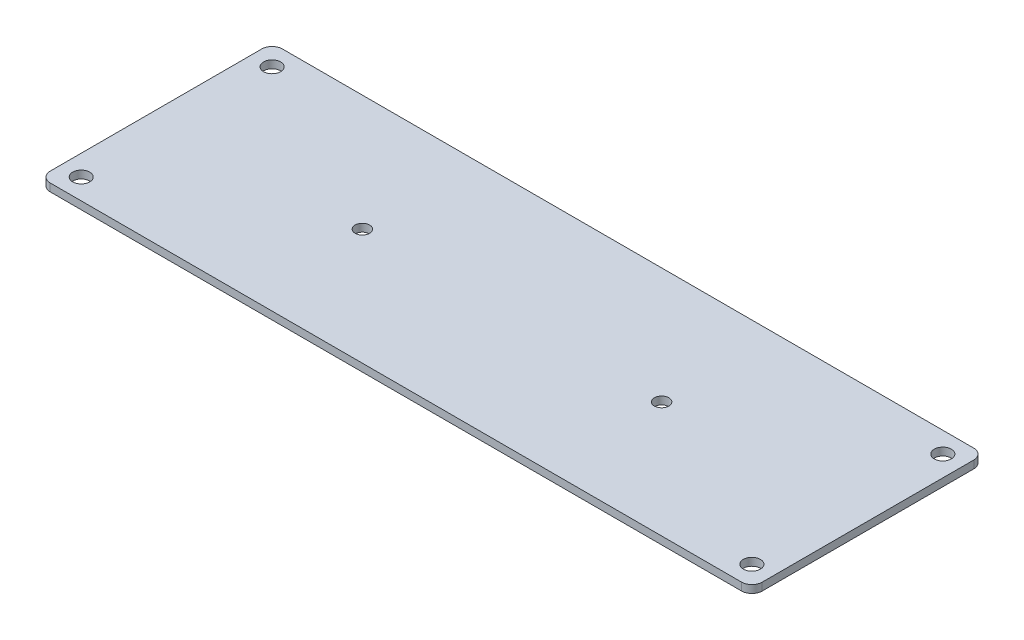
ISO-10303-21;
HEADER;
FILE_DESCRIPTION(('STEP AP214'),'2;1');
FILE_NAME('part.step','',(''),(''),'','','');
FILE_SCHEMA(('AUTOMOTIVE_DESIGN { 1 0 10303 214 1 1 1 1 }'));
ENDSEC;
DATA;
#1=APPLICATION_CONTEXT('core data for automotive mechanical design processes');
#2=APPLICATION_PROTOCOL_DEFINITION('international standard','automotive_design',2000,#1);
#3=PRODUCT_CONTEXT('',#1,'mechanical');
#4=PRODUCT('Part','Part','',(#3));
#5=PRODUCT_RELATED_PRODUCT_CATEGORY('part','',(#4));
#6=PRODUCT_DEFINITION_FORMATION('','',#4);
#7=PRODUCT_DEFINITION_CONTEXT('part definition',#1,'design');
#8=PRODUCT_DEFINITION('design','',#6,#7);
#9=PRODUCT_DEFINITION_SHAPE('','',#8);
#10=(LENGTH_UNIT() NAMED_UNIT(*) SI_UNIT(.MILLI.,.METRE.));
#11=(NAMED_UNIT(*) PLANE_ANGLE_UNIT() SI_UNIT($,.RADIAN.));
#12=(NAMED_UNIT(*) SI_UNIT($,.STERADIAN.) SOLID_ANGLE_UNIT());
#13=UNCERTAINTY_MEASURE_WITH_UNIT(LENGTH_MEASURE(1.E-05),#10,'distance_accuracy_value','');
#14=(GEOMETRIC_REPRESENTATION_CONTEXT(3) GLOBAL_UNCERTAINTY_ASSIGNED_CONTEXT((#13)) GLOBAL_UNIT_ASSIGNED_CONTEXT((#10,
#11,#12)) REPRESENTATION_CONTEXT('',''));
#15=CARTESIAN_POINT('',(0.,0.,0.));
#16=DIRECTION('',(0.,0.,1.));
#17=DIRECTION('',(1.,0.,0.));
#18=AXIS2_PLACEMENT_3D('',#15,#16,#17);
#19=CARTESIAN_POINT('',(0.,1.5,0.));
#20=DIRECTION('',(0.,1.,0.));
#21=DIRECTION('',(0.,0.,1.));
#22=AXIS2_PLACEMENT_3D('',#19,#20,#21);
#23=PLANE('',#22);
#24=CARTESIAN_POINT('',(-65.,1.5,18.5));
#25=DIRECTION('',(0.,1.,0.));
#26=DIRECTION('',(0.,0.,1.));
#27=AXIS2_PLACEMENT_3D('',#24,#25,#26);
#28=CIRCLE('',#27,1.65);
#29=CARTESIAN_POINT('',(-65.,1.5,20.15));
#30=VERTEX_POINT('',#29);
#31=EDGE_CURVE('E253',#30,#30,#28,.T.);
#32=ORIENTED_EDGE('',*,*,#31,.F.);
#33=EDGE_LOOP('',(#32));
#34=FACE_BOUND('',#33,.T.);
#35=CARTESIAN_POINT('',(65.,1.5,-18.5));
#36=DIRECTION('',(0.,1.,0.));
#37=DIRECTION('',(0.,0.,1.));
#38=AXIS2_PLACEMENT_3D('',#35,#36,#37);
#39=CIRCLE('',#38,1.65);
#40=CARTESIAN_POINT('',(65.,1.5,-16.85));
#41=VERTEX_POINT('',#40);
#42=EDGE_CURVE('E244',#41,#41,#39,.T.);
#43=ORIENTED_EDGE('',*,*,#42,.F.);
#44=EDGE_LOOP('',(#43));
#45=FACE_BOUND('',#44,.T.);
#46=CARTESIAN_POINT('',(65.,1.5,18.5));
#47=DIRECTION('',(0.,1.,0.));
#48=DIRECTION('',(0.,0.,1.));
#49=AXIS2_PLACEMENT_3D('',#46,#47,#48);
#50=CIRCLE('',#49,1.65);
#51=CARTESIAN_POINT('',(65.,1.5,20.15));
#52=VERTEX_POINT('',#51);
#53=EDGE_CURVE('E260',#52,#52,#50,.T.);
#54=ORIENTED_EDGE('',*,*,#53,.F.);
#55=EDGE_LOOP('',(#54));
#56=FACE_BOUND('',#55,.T.);
#57=CARTESIAN_POINT('',(-65.,1.5,-18.5));
#58=DIRECTION('',(0.,1.,0.));
#59=DIRECTION('',(0.,0.,1.));
#60=AXIS2_PLACEMENT_3D('',#57,#58,#59);
#61=CIRCLE('',#60,1.65);
#62=CARTESIAN_POINT('',(-65.,1.5,-16.85));
#63=VERTEX_POINT('',#62);
#64=EDGE_CURVE('E236',#63,#63,#61,.T.);
#65=ORIENTED_EDGE('',*,*,#64,.F.);
#66=EDGE_LOOP('',(#65));
#67=FACE_BOUND('',#66,.T.);
#68=CARTESIAN_POINT('',(-29.,1.5,0.));
#69=DIRECTION('',(0.,1.,0.));
#70=DIRECTION('',(0.,0.,1.));
#71=AXIS2_PLACEMENT_3D('',#68,#69,#70);
#72=CIRCLE('',#71,1.4);
#73=CARTESIAN_POINT('',(-29.,1.5,1.4));
#74=VERTEX_POINT('',#73);
#75=EDGE_CURVE('E151',#74,#74,#72,.T.);
#76=ORIENTED_EDGE('',*,*,#75,.F.);
#77=EDGE_LOOP('',(#76));
#78=FACE_BOUND('',#77,.T.);
#79=DIRECTION('',(-1.,0.,0.));
#80=VECTOR('',#79,1.);
#81=CARTESIAN_POINT('',(69.,1.5,-22.5));
#82=LINE('',#81,#80);
#83=CARTESIAN_POINT('',(67.,1.5,-22.5));
#84=VERTEX_POINT('',#83);
#85=CARTESIAN_POINT('',(-67.,1.5,-22.5));
#86=VERTEX_POINT('',#85);
#87=EDGE_CURVE('E163',#84,#86,#82,.T.);
#88=ORIENTED_EDGE('',*,*,#87,.T.);
#89=CARTESIAN_POINT('',(-67.,1.5,-20.5));
#90=DIRECTION('',(0.,1.,0.));
#91=DIRECTION('',(0.,0.,1.));
#92=AXIS2_PLACEMENT_3D('',#89,#90,#91);
#93=CIRCLE('',#92,2.);
#94=CARTESIAN_POINT('',(-69.,1.5,-20.5));
#95=VERTEX_POINT('',#94);
#96=EDGE_CURVE('E193',#86,#95,#93,.T.);
#97=ORIENTED_EDGE('',*,*,#96,.T.);
#98=DIRECTION('',(0.,0.,1.));
#99=VECTOR('',#98,1.);
#100=CARTESIAN_POINT('',(-69.,1.5,22.5));
#101=LINE('',#100,#99);
#102=CARTESIAN_POINT('',(-69.,1.5,20.5));
#103=VERTEX_POINT('',#102);
#104=EDGE_CURVE('E141',#95,#103,#101,.T.);
#105=ORIENTED_EDGE('',*,*,#104,.T.);
#106=CARTESIAN_POINT('',(-67.,1.5,20.5));
#107=DIRECTION('',(0.,1.,0.));
#108=DIRECTION('',(0.,0.,1.));
#109=AXIS2_PLACEMENT_3D('',#106,#107,#108);
#110=CIRCLE('',#109,2.);
#111=CARTESIAN_POINT('',(-67.,1.5,22.5));
#112=VERTEX_POINT('',#111);
#113=EDGE_CURVE('E185',#103,#112,#110,.T.);
#114=ORIENTED_EDGE('',*,*,#113,.T.);
#115=DIRECTION('',(1.,0.,0.));
#116=VECTOR('',#115,1.);
#117=CARTESIAN_POINT('',(69.,1.5,22.5));
#118=LINE('',#117,#116);
#119=CARTESIAN_POINT('',(67.,1.5,22.5));
#120=VERTEX_POINT('',#119);
#121=EDGE_CURVE('E209',#112,#120,#118,.T.);
#122=ORIENTED_EDGE('',*,*,#121,.T.);
#123=CARTESIAN_POINT('',(67.,1.5,20.5));
#124=DIRECTION('',(0.,1.,0.));
#125=DIRECTION('',(0.,0.,1.));
#126=AXIS2_PLACEMENT_3D('',#123,#124,#125);
#127=CIRCLE('',#126,2.);
#128=CARTESIAN_POINT('',(69.,1.5,20.5));
#129=VERTEX_POINT('',#128);
#130=EDGE_CURVE('E67',#120,#129,#127,.T.);
#131=ORIENTED_EDGE('',*,*,#130,.T.);
#132=DIRECTION('',(0.,0.,-1.));
#133=VECTOR('',#132,1.);
#134=CARTESIAN_POINT('',(69.,1.5,22.5));
#135=LINE('',#134,#133);
#136=CARTESIAN_POINT('',(69.,1.5,-20.5));
#137=VERTEX_POINT('',#136);
#138=EDGE_CURVE('E217',#129,#137,#135,.T.);
#139=ORIENTED_EDGE('',*,*,#138,.T.);
#140=CARTESIAN_POINT('',(67.,1.5,-20.5));
#141=DIRECTION('',(0.,1.,0.));
#142=DIRECTION('',(0.,0.,1.));
#143=AXIS2_PLACEMENT_3D('',#140,#141,#142);
#144=CIRCLE('',#143,2.);
#145=EDGE_CURVE('E190',#137,#84,#144,.T.);
#146=ORIENTED_EDGE('',*,*,#145,.T.);
#147=EDGE_LOOP('',(#88,#97,#105,#114,#122,#131,#139,#146));
#148=FACE_BOUND('',#147,.T.);
#149=CARTESIAN_POINT('',(29.,1.5,0.));
#150=DIRECTION('',(0.,1.,0.));
#151=DIRECTION('',(0.,0.,1.));
#152=AXIS2_PLACEMENT_3D('',#149,#150,#151);
#153=CIRCLE('',#152,1.4);
#154=CARTESIAN_POINT('',(29.,1.5,1.4));
#155=VERTEX_POINT('',#154);
#156=EDGE_CURVE('E226',#155,#155,#153,.T.);
#157=ORIENTED_EDGE('',*,*,#156,.F.);
#158=EDGE_LOOP('',(#157));
#159=FACE_BOUND('',#158,.T.);
#160=ADVANCED_FACE('F38',(#34,#45,#56,#67,#78,#148,#159),#23,.T.);
#161=CARTESIAN_POINT('',(0.,0.,0.));
#162=DIRECTION('',(0.,1.,0.));
#163=DIRECTION('',(0.,0.,1.));
#164=AXIS2_PLACEMENT_3D('',#161,#162,#163);
#165=PLANE('',#164);
#166=CARTESIAN_POINT('',(-65.,0.,18.5));
#167=DIRECTION('',(0.,1.,0.));
#168=DIRECTION('',(0.,0.,1.));
#169=AXIS2_PLACEMENT_3D('',#166,#167,#168);
#170=CIRCLE('',#169,1.65);
#171=CARTESIAN_POINT('',(-65.,0.,20.15));
#172=VERTEX_POINT('',#171);
#173=EDGE_CURVE('E240',#172,#172,#170,.T.);
#174=ORIENTED_EDGE('',*,*,#173,.T.);
#175=EDGE_LOOP('',(#174));
#176=FACE_BOUND('',#175,.T.);
#177=CARTESIAN_POINT('',(65.,0.,-18.5));
#178=DIRECTION('',(0.,1.,0.));
#179=DIRECTION('',(0.,0.,1.));
#180=AXIS2_PLACEMENT_3D('',#177,#178,#179);
#181=CIRCLE('',#180,1.65);
#182=CARTESIAN_POINT('',(65.,0.,-16.85));
#183=VERTEX_POINT('',#182);
#184=EDGE_CURVE('E248',#183,#183,#181,.T.);
#185=ORIENTED_EDGE('',*,*,#184,.T.);
#186=EDGE_LOOP('',(#185));
#187=FACE_BOUND('',#186,.T.);
#188=CARTESIAN_POINT('',(65.,0.,18.5));
#189=DIRECTION('',(0.,1.,0.));
#190=DIRECTION('',(0.,0.,1.));
#191=AXIS2_PLACEMENT_3D('',#188,#189,#190);
#192=CIRCLE('',#191,1.65);
#193=CARTESIAN_POINT('',(65.,0.,20.15));
#194=VERTEX_POINT('',#193);
#195=EDGE_CURVE('E249',#194,#194,#192,.T.);
#196=ORIENTED_EDGE('',*,*,#195,.T.);
#197=EDGE_LOOP('',(#196));
#198=FACE_BOUND('',#197,.T.);
#199=CARTESIAN_POINT('',(-65.,0.,-18.5));
#200=DIRECTION('',(0.,1.,0.));
#201=DIRECTION('',(0.,0.,1.));
#202=AXIS2_PLACEMENT_3D('',#199,#200,#201);
#203=CIRCLE('',#202,1.65);
#204=CARTESIAN_POINT('',(-65.,0.,-16.85));
#205=VERTEX_POINT('',#204);
#206=EDGE_CURVE('E232',#205,#205,#203,.T.);
#207=ORIENTED_EDGE('',*,*,#206,.T.);
#208=EDGE_LOOP('',(#207));
#209=FACE_BOUND('',#208,.T.);
#210=DIRECTION('',(0.,0.,1.));
#211=VECTOR('',#210,1.);
#212=CARTESIAN_POINT('',(-69.,0.,22.5));
#213=LINE('',#212,#211);
#214=CARTESIAN_POINT('',(-69.,0.,-20.5));
#215=VERTEX_POINT('',#214);
#216=CARTESIAN_POINT('',(-69.,0.,20.5));
#217=VERTEX_POINT('',#216);
#218=EDGE_CURVE('E138',#215,#217,#213,.T.);
#219=ORIENTED_EDGE('',*,*,#218,.F.);
#220=CARTESIAN_POINT('',(-67.,0.,-20.5));
#221=DIRECTION('',(0.,1.,0.));
#222=DIRECTION('',(0.,0.,1.));
#223=AXIS2_PLACEMENT_3D('',#220,#221,#222);
#224=CIRCLE('',#223,2.);
#225=CARTESIAN_POINT('',(-67.,0.,-22.5));
#226=VERTEX_POINT('',#225);
#227=EDGE_CURVE('E120',#215,#226,#224,.F.);
#228=ORIENTED_EDGE('',*,*,#227,.T.);
#229=DIRECTION('',(-1.,0.,0.));
#230=VECTOR('',#229,1.);
#231=CARTESIAN_POINT('',(69.,0.,-22.5));
#232=LINE('',#231,#230);
#233=CARTESIAN_POINT('',(67.,0.,-22.5));
#234=VERTEX_POINT('',#233);
#235=EDGE_CURVE('E168',#234,#226,#232,.T.);
#236=ORIENTED_EDGE('',*,*,#235,.F.);
#237=CARTESIAN_POINT('',(67.,0.,-20.5));
#238=DIRECTION('',(0.,1.,0.));
#239=DIRECTION('',(0.,0.,1.));
#240=AXIS2_PLACEMENT_3D('',#237,#238,#239);
#241=CIRCLE('',#240,2.);
#242=CARTESIAN_POINT('',(69.,0.,-20.5));
#243=VERTEX_POINT('',#242);
#244=EDGE_CURVE('E132',#234,#243,#241,.F.);
#245=ORIENTED_EDGE('',*,*,#244,.T.);
#246=DIRECTION('',(0.,0.,-1.));
#247=VECTOR('',#246,1.);
#248=CARTESIAN_POINT('',(69.,0.,22.5));
#249=LINE('',#248,#247);
#250=CARTESIAN_POINT('',(69.,0.,20.5));
#251=VERTEX_POINT('',#250);
#252=EDGE_CURVE('E157',#251,#243,#249,.T.);
#253=ORIENTED_EDGE('',*,*,#252,.F.);
#254=CARTESIAN_POINT('',(67.,0.,20.5));
#255=DIRECTION('',(0.,1.,0.));
#256=DIRECTION('',(0.,0.,1.));
#257=AXIS2_PLACEMENT_3D('',#254,#255,#256);
#258=CIRCLE('',#257,2.);
#259=CARTESIAN_POINT('',(67.,0.,22.5));
#260=VERTEX_POINT('',#259);
#261=EDGE_CURVE('E175',#251,#260,#258,.F.);
#262=ORIENTED_EDGE('',*,*,#261,.T.);
#263=DIRECTION('',(1.,0.,0.));
#264=VECTOR('',#263,1.);
#265=CARTESIAN_POINT('',(69.,0.,22.5));
#266=LINE('',#265,#264);
#267=CARTESIAN_POINT('',(-67.,0.,22.5));
#268=VERTEX_POINT('',#267);
#269=EDGE_CURVE('E150',#268,#260,#266,.T.);
#270=ORIENTED_EDGE('',*,*,#269,.F.);
#271=CARTESIAN_POINT('',(-67.,0.,20.5));
#272=DIRECTION('',(0.,1.,0.));
#273=DIRECTION('',(0.,0.,1.));
#274=AXIS2_PLACEMENT_3D('',#271,#272,#273);
#275=CIRCLE('',#274,2.);
#276=EDGE_CURVE('E143',#268,#217,#275,.F.);
#277=ORIENTED_EDGE('',*,*,#276,.T.);
#278=EDGE_LOOP('',(#219,#228,#236,#245,#253,#262,#270,#277));
#279=FACE_BOUND('',#278,.T.);
#280=CARTESIAN_POINT('',(-29.,0.,0.));
#281=DIRECTION('',(0.,1.,0.));
#282=DIRECTION('',(0.,0.,1.));
#283=AXIS2_PLACEMENT_3D('',#280,#281,#282);
#284=CIRCLE('',#283,1.4);
#285=CARTESIAN_POINT('',(-29.,0.,1.4));
#286=VERTEX_POINT('',#285);
#287=EDGE_CURVE('E160',#286,#286,#284,.T.);
#288=ORIENTED_EDGE('',*,*,#287,.T.);
#289=EDGE_LOOP('',(#288));
#290=FACE_BOUND('',#289,.T.);
#291=CARTESIAN_POINT('',(29.,0.,0.));
#292=DIRECTION('',(0.,1.,0.));
#293=DIRECTION('',(0.,0.,1.));
#294=AXIS2_PLACEMENT_3D('',#291,#292,#293);
#295=CIRCLE('',#294,1.4);
#296=CARTESIAN_POINT('',(29.,0.,1.4));
#297=VERTEX_POINT('',#296);
#298=EDGE_CURVE('E228',#297,#297,#295,.T.);
#299=ORIENTED_EDGE('',*,*,#298,.T.);
#300=EDGE_LOOP('',(#299));
#301=FACE_BOUND('',#300,.T.);
#302=ADVANCED_FACE('F146',(#176,#187,#198,#209,#279,#290,#301),#165,.F.);
#303=CARTESIAN_POINT('',(-69.,1.5,22.5));
#304=DIRECTION('',(1.,0.,0.));
#305=DIRECTION('',(0.,0.,-1.));
#306=AXIS2_PLACEMENT_3D('',#303,#304,#305);
#307=PLANE('',#306);
#308=ORIENTED_EDGE('',*,*,#104,.F.);
#309=DIRECTION('',(0.,-1.,0.));
#310=VECTOR('',#309,1.);
#311=CARTESIAN_POINT('',(-69.,1.5,-20.5));
#312=LINE('',#311,#310);
#313=EDGE_CURVE('E124',#95,#215,#312,.T.);
#314=ORIENTED_EDGE('',*,*,#313,.T.);
#315=ORIENTED_EDGE('',*,*,#218,.T.);
#316=DIRECTION('',(0.,-1.,0.));
#317=VECTOR('',#316,1.);
#318=CARTESIAN_POINT('',(-69.,1.5,20.5));
#319=LINE('',#318,#317);
#320=EDGE_CURVE('E144',#217,#103,#319,.F.);
#321=ORIENTED_EDGE('',*,*,#320,.T.);
#322=EDGE_LOOP('',(#308,#314,#315,#321));
#323=FACE_BOUND('',#322,.T.);
#324=ADVANCED_FACE('F137',(#323),#307,.F.);
#325=CARTESIAN_POINT('',(69.,1.5,22.5));
#326=DIRECTION('',(0.,0.,-1.));
#327=DIRECTION('',(-1.,0.,0.));
#328=AXIS2_PLACEMENT_3D('',#325,#326,#327);
#329=PLANE('',#328);
#330=ORIENTED_EDGE('',*,*,#269,.T.);
#331=DIRECTION('',(0.,-1.,0.));
#332=VECTOR('',#331,1.);
#333=CARTESIAN_POINT('',(67.,1.5,22.5));
#334=LINE('',#333,#332);
#335=EDGE_CURVE('E11',#260,#120,#334,.F.);
#336=ORIENTED_EDGE('',*,*,#335,.T.);
#337=ORIENTED_EDGE('',*,*,#121,.F.);
#338=DIRECTION('',(0.,-1.,0.));
#339=VECTOR('',#338,1.);
#340=CARTESIAN_POINT('',(-67.,1.5,22.5));
#341=LINE('',#340,#339);
#342=EDGE_CURVE('E47',#112,#268,#341,.T.);
#343=ORIENTED_EDGE('',*,*,#342,.T.);
#344=EDGE_LOOP('',(#330,#336,#337,#343));
#345=FACE_BOUND('',#344,.T.);
#346=ADVANCED_FACE('F207',(#345),#329,.F.);
#347=CARTESIAN_POINT('',(69.,1.5,22.5));
#348=DIRECTION('',(-1.,0.,0.));
#349=DIRECTION('',(0.,0.,1.));
#350=AXIS2_PLACEMENT_3D('',#347,#348,#349);
#351=PLANE('',#350);
#352=ORIENTED_EDGE('',*,*,#252,.T.);
#353=DIRECTION('',(0.,-1.,0.));
#354=VECTOR('',#353,1.);
#355=CARTESIAN_POINT('',(69.,1.5,-20.5));
#356=LINE('',#355,#354);
#357=EDGE_CURVE('E57',#243,#137,#356,.F.);
#358=ORIENTED_EDGE('',*,*,#357,.T.);
#359=ORIENTED_EDGE('',*,*,#138,.F.);
#360=DIRECTION('',(0.,-1.,0.));
#361=VECTOR('',#360,1.);
#362=CARTESIAN_POINT('',(69.,1.5,20.5));
#363=LINE('',#362,#361);
#364=EDGE_CURVE('E196',#129,#251,#363,.T.);
#365=ORIENTED_EDGE('',*,*,#364,.T.);
#366=EDGE_LOOP('',(#352,#358,#359,#365));
#367=FACE_BOUND('',#366,.T.);
#368=ADVANCED_FACE('F216',(#367),#351,.F.);
#369=CARTESIAN_POINT('',(69.,1.5,-22.5));
#370=DIRECTION('',(0.,0.,1.));
#371=DIRECTION('',(1.,0.,0.));
#372=AXIS2_PLACEMENT_3D('',#369,#370,#371);
#373=PLANE('',#372);
#374=ORIENTED_EDGE('',*,*,#235,.T.);
#375=DIRECTION('',(0.,-1.,0.));
#376=VECTOR('',#375,1.);
#377=CARTESIAN_POINT('',(-67.,1.5,-22.5));
#378=LINE('',#377,#376);
#379=EDGE_CURVE('E125',#226,#86,#378,.F.);
#380=ORIENTED_EDGE('',*,*,#379,.T.);
#381=ORIENTED_EDGE('',*,*,#87,.F.);
#382=DIRECTION('',(0.,-1.,0.));
#383=VECTOR('',#382,1.);
#384=CARTESIAN_POINT('',(67.,1.5,-22.5));
#385=LINE('',#384,#383);
#386=EDGE_CURVE('E131',#84,#234,#385,.T.);
#387=ORIENTED_EDGE('',*,*,#386,.T.);
#388=EDGE_LOOP('',(#374,#380,#381,#387));
#389=FACE_BOUND('',#388,.T.);
#390=ADVANCED_FACE('F305',(#389),#373,.F.);
#391=CARTESIAN_POINT('',(-29.,1.5,0.));
#392=DIRECTION('',(0.,-1.,0.));
#393=DIRECTION('',(0.,0.,-1.));
#394=AXIS2_PLACEMENT_3D('',#391,#392,#393);
#395=CYLINDRICAL_SURFACE('',#394,1.4);
#396=ORIENTED_EDGE('',*,*,#75,.T.);
#397=EDGE_LOOP('',(#396));
#398=FACE_BOUND('',#397,.T.);
#399=ORIENTED_EDGE('',*,*,#287,.F.);
#400=EDGE_LOOP('',(#399));
#401=FACE_BOUND('',#400,.T.);
#402=ADVANCED_FACE('F291',(#398,#401),#395,.F.);
#403=CARTESIAN_POINT('',(29.,1.5,0.));
#404=DIRECTION('',(0.,-1.,0.));
#405=DIRECTION('',(0.,0.,-1.));
#406=AXIS2_PLACEMENT_3D('',#403,#404,#405);
#407=CYLINDRICAL_SURFACE('',#406,1.4);
#408=ORIENTED_EDGE('',*,*,#156,.T.);
#409=EDGE_LOOP('',(#408));
#410=FACE_BOUND('',#409,.T.);
#411=ORIENTED_EDGE('',*,*,#298,.F.);
#412=EDGE_LOOP('',(#411));
#413=FACE_BOUND('',#412,.T.);
#414=ADVANCED_FACE('F288',(#410,#413),#407,.F.);
#415=CARTESIAN_POINT('',(-65.,0.,-18.5));
#416=DIRECTION('',(0.,1.,0.));
#417=DIRECTION('',(0.,0.,1.));
#418=AXIS2_PLACEMENT_3D('',#415,#416,#417);
#419=CYLINDRICAL_SURFACE('',#418,1.65);
#420=ORIENTED_EDGE('',*,*,#206,.F.);
#421=EDGE_LOOP('',(#420));
#422=FACE_BOUND('',#421,.T.);
#423=ORIENTED_EDGE('',*,*,#64,.T.);
#424=EDGE_LOOP('',(#423));
#425=FACE_BOUND('',#424,.T.);
#426=ADVANCED_FACE('F273',(#422,#425),#419,.F.);
#427=CARTESIAN_POINT('',(65.,0.,18.5));
#428=DIRECTION('',(0.,1.,0.));
#429=DIRECTION('',(0.,0.,1.));
#430=AXIS2_PLACEMENT_3D('',#427,#428,#429);
#431=CYLINDRICAL_SURFACE('',#430,1.65);
#432=ORIENTED_EDGE('',*,*,#195,.F.);
#433=EDGE_LOOP('',(#432));
#434=FACE_BOUND('',#433,.T.);
#435=ORIENTED_EDGE('',*,*,#53,.T.);
#436=EDGE_LOOP('',(#435));
#437=FACE_BOUND('',#436,.T.);
#438=ADVANCED_FACE('F269',(#434,#437),#431,.F.);
#439=CARTESIAN_POINT('',(65.,0.,-18.5));
#440=DIRECTION('',(0.,1.,0.));
#441=DIRECTION('',(0.,0.,1.));
#442=AXIS2_PLACEMENT_3D('',#439,#440,#441);
#443=CYLINDRICAL_SURFACE('',#442,1.65);
#444=ORIENTED_EDGE('',*,*,#184,.F.);
#445=EDGE_LOOP('',(#444));
#446=FACE_BOUND('',#445,.T.);
#447=ORIENTED_EDGE('',*,*,#42,.T.);
#448=EDGE_LOOP('',(#447));
#449=FACE_BOUND('',#448,.T.);
#450=ADVANCED_FACE('F272',(#446,#449),#443,.F.);
#451=CARTESIAN_POINT('',(-65.,0.,18.5));
#452=DIRECTION('',(0.,1.,0.));
#453=DIRECTION('',(0.,0.,1.));
#454=AXIS2_PLACEMENT_3D('',#451,#452,#453);
#455=CYLINDRICAL_SURFACE('',#454,1.65);
#456=ORIENTED_EDGE('',*,*,#173,.F.);
#457=EDGE_LOOP('',(#456));
#458=FACE_BOUND('',#457,.T.);
#459=ORIENTED_EDGE('',*,*,#31,.T.);
#460=EDGE_LOOP('',(#459));
#461=FACE_BOUND('',#460,.T.);
#462=ADVANCED_FACE('F316',(#458,#461),#455,.F.);
#463=CARTESIAN_POINT('',(-67.,1.5,-20.5));
#464=DIRECTION('',(0.,-1.,0.));
#465=DIRECTION('',(0.,0.,-1.));
#466=AXIS2_PLACEMENT_3D('',#463,#464,#465);
#467=CYLINDRICAL_SURFACE('',#466,2.);
#468=ORIENTED_EDGE('',*,*,#96,.F.);
#469=ORIENTED_EDGE('',*,*,#379,.F.);
#470=ORIENTED_EDGE('',*,*,#227,.F.);
#471=ORIENTED_EDGE('',*,*,#313,.F.);
#472=EDGE_LOOP('',(#468,#469,#470,#471));
#473=FACE_BOUND('',#472,.T.);
#474=ADVANCED_FACE('F123',(#473),#467,.T.);
#475=CARTESIAN_POINT('',(67.,1.5,-20.5));
#476=DIRECTION('',(0.,-1.,0.));
#477=DIRECTION('',(0.,0.,-1.));
#478=AXIS2_PLACEMENT_3D('',#475,#476,#477);
#479=CYLINDRICAL_SURFACE('',#478,2.);
#480=ORIENTED_EDGE('',*,*,#145,.F.);
#481=ORIENTED_EDGE('',*,*,#357,.F.);
#482=ORIENTED_EDGE('',*,*,#244,.F.);
#483=ORIENTED_EDGE('',*,*,#386,.F.);
#484=EDGE_LOOP('',(#480,#481,#482,#483));
#485=FACE_BOUND('',#484,.T.);
#486=ADVANCED_FACE('F315',(#485),#479,.T.);
#487=CARTESIAN_POINT('',(67.,1.5,20.5));
#488=DIRECTION('',(0.,-1.,0.));
#489=DIRECTION('',(0.,0.,-1.));
#490=AXIS2_PLACEMENT_3D('',#487,#488,#489);
#491=CYLINDRICAL_SURFACE('',#490,2.);
#492=ORIENTED_EDGE('',*,*,#130,.F.);
#493=ORIENTED_EDGE('',*,*,#335,.F.);
#494=ORIENTED_EDGE('',*,*,#261,.F.);
#495=ORIENTED_EDGE('',*,*,#364,.F.);
#496=EDGE_LOOP('',(#492,#493,#494,#495));
#497=FACE_BOUND('',#496,.T.);
#498=ADVANCED_FACE('F215',(#497),#491,.T.);
#499=CARTESIAN_POINT('',(-67.,1.5,20.5));
#500=DIRECTION('',(0.,-1.,0.));
#501=DIRECTION('',(0.,0.,-1.));
#502=AXIS2_PLACEMENT_3D('',#499,#500,#501);
#503=CYLINDRICAL_SURFACE('',#502,2.);
#504=ORIENTED_EDGE('',*,*,#113,.F.);
#505=ORIENTED_EDGE('',*,*,#320,.F.);
#506=ORIENTED_EDGE('',*,*,#276,.F.);
#507=ORIENTED_EDGE('',*,*,#342,.F.);
#508=EDGE_LOOP('',(#504,#505,#506,#507));
#509=FACE_BOUND('',#508,.T.);
#510=ADVANCED_FACE('F40',(#509),#503,.T.);
#511=CLOSED_SHELL('',(#160,#302,#324,#346,#368,#390,#402,#414,#426,#438,#450,#462,#474,#486,
#498,#510));
#512=MANIFOLD_SOLID_BREP('B2',#511);
#513=ADVANCED_BREP_SHAPE_REPRESENTATION('',(#18,#512),#14);
#514=SHAPE_DEFINITION_REPRESENTATION(#9,#513);
ENDSEC;
END-ISO-10303-21;
